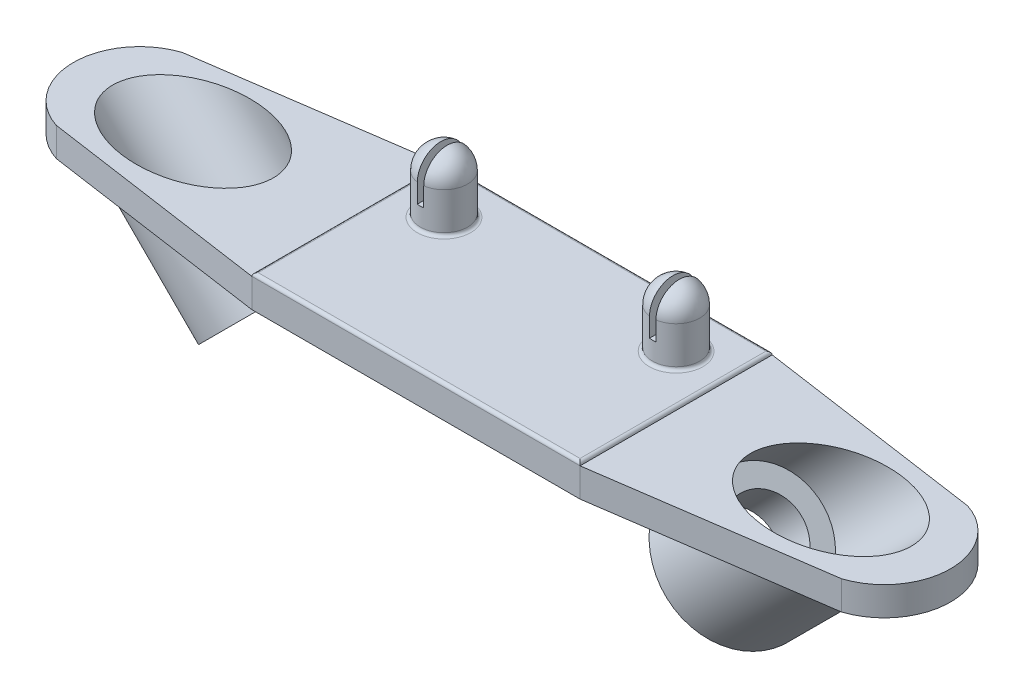
ISO-10303-21;
HEADER;
FILE_DESCRIPTION(('STEP AP214'),'2;1');
FILE_NAME('part.step','',(''),(''),'','','');
FILE_SCHEMA(('AUTOMOTIVE_DESIGN { 1 0 10303 214 1 1 1 1 }'));
ENDSEC;
DATA;
#1=APPLICATION_CONTEXT('core data for automotive mechanical design processes');
#2=APPLICATION_PROTOCOL_DEFINITION('international standard','automotive_design',2000,#1);
#3=PRODUCT_CONTEXT('',#1,'mechanical');
#4=PRODUCT('Part','Part','',(#3));
#5=PRODUCT_RELATED_PRODUCT_CATEGORY('part','',(#4));
#6=PRODUCT_DEFINITION_FORMATION('','',#4);
#7=PRODUCT_DEFINITION_CONTEXT('part definition',#1,'design');
#8=PRODUCT_DEFINITION('design','',#6,#7);
#9=PRODUCT_DEFINITION_SHAPE('','',#8);
#10=(LENGTH_UNIT() NAMED_UNIT(*) SI_UNIT(.MILLI.,.METRE.));
#11=(NAMED_UNIT(*) PLANE_ANGLE_UNIT() SI_UNIT($,.RADIAN.));
#12=(NAMED_UNIT(*) SI_UNIT($,.STERADIAN.) SOLID_ANGLE_UNIT());
#13=UNCERTAINTY_MEASURE_WITH_UNIT(LENGTH_MEASURE(1.E-05),#10,'distance_accuracy_value','');
#14=(GEOMETRIC_REPRESENTATION_CONTEXT(3) GLOBAL_UNCERTAINTY_ASSIGNED_CONTEXT((#13)) GLOBAL_UNIT_ASSIGNED_CONTEXT((#10,
#11,#12)) REPRESENTATION_CONTEXT('',''));
#15=CARTESIAN_POINT('',(0.,0.,0.));
#16=DIRECTION('',(0.,0.,1.));
#17=DIRECTION('',(1.,0.,0.));
#18=AXIS2_PLACEMENT_3D('',#15,#16,#17);
#19=CARTESIAN_POINT('',(7.25,6.,-2.99999999999999));
#20=DIRECTION('',(0.,-1.,0.));
#21=DIRECTION('',(0.,0.,-1.));
#22=AXIS2_PLACEMENT_3D('',#19,#20,#21);
#23=CYLINDRICAL_SURFACE('',#22,1.475);
#24=CARTESIAN_POINT('',(7.25,2.2,-2.99999999999999));
#25=DIRECTION('',(0.,-1.,0.));
#26=DIRECTION('',(0.,0.,-1.));
#27=AXIS2_PLACEMENT_3D('',#24,#25,#26);
#28=CIRCLE('',#27,1.475);
#29=CARTESIAN_POINT('',(7.25,2.2,-4.47499999999999));
#30=VERTEX_POINT('',#29);
#31=EDGE_CURVE('E320',#30,#30,#28,.F.);
#32=ORIENTED_EDGE('',*,*,#31,.T.);
#33=EDGE_LOOP('',(#32));
#34=FACE_BOUND('',#33,.T.);
#35=DIRECTION('',(0.,-1.,0.));
#36=VECTOR('',#35,1.);
#37=CARTESIAN_POINT('',(7.05,6.,-4.46137777456754));
#38=LINE('',#37,#36);
#39=CARTESIAN_POINT('',(7.05,3.33333333333333,-4.46137777456754));
#40=VERTEX_POINT('',#39);
#41=CARTESIAN_POINT('',(7.05,4.525,-4.46137777456754));
#42=VERTEX_POINT('',#41);
#43=EDGE_CURVE('E169',#40,#42,#38,.F.);
#44=ORIENTED_EDGE('',*,*,#43,.F.);
#45=CARTESIAN_POINT('',(7.25,3.33333333333333,-2.99999999999999));
#46=DIRECTION('',(0.,1.,0.));
#47=DIRECTION('',(0.,0.,1.));
#48=AXIS2_PLACEMENT_3D('',#45,#46,#47);
#49=CIRCLE('',#48,1.475);
#50=CARTESIAN_POINT('',(7.45,3.33333333333333,-4.46137777456754));
#51=VERTEX_POINT('',#50);
#52=EDGE_CURVE('E11',#51,#40,#49,.T.);
#53=ORIENTED_EDGE('',*,*,#52,.F.);
#54=DIRECTION('',(0.,-1.,0.));
#55=VECTOR('',#54,1.);
#56=CARTESIAN_POINT('',(7.45,6.,-4.46137777456754));
#57=LINE('',#56,#55);
#58=CARTESIAN_POINT('',(7.45,4.525,-4.46137777456754));
#59=VERTEX_POINT('',#58);
#60=EDGE_CURVE('E160',#59,#51,#57,.T.);
#61=ORIENTED_EDGE('',*,*,#60,.F.);
#62=CARTESIAN_POINT('',(7.25,4.525,-2.99999999999999));
#63=DIRECTION('',(0.,-1.,0.));
#64=DIRECTION('',(0.,0.,-1.));
#65=AXIS2_PLACEMENT_3D('',#62,#63,#64);
#66=CIRCLE('',#65,1.475);
#67=CARTESIAN_POINT('',(7.45,4.525,-1.53862222543244));
#68=VERTEX_POINT('',#67);
#69=EDGE_CURVE('E285',#59,#68,#66,.T.);
#70=ORIENTED_EDGE('',*,*,#69,.T.);
#71=DIRECTION('',(0.,-1.,0.));
#72=VECTOR('',#71,1.);
#73=CARTESIAN_POINT('',(7.45,6.,-1.53862222543244));
#74=LINE('',#73,#72);
#75=CARTESIAN_POINT('',(7.45,3.33333333333333,-1.53862222543244));
#76=VERTEX_POINT('',#75);
#77=EDGE_CURVE('E51',#76,#68,#74,.F.);
#78=ORIENTED_EDGE('',*,*,#77,.F.);
#79=CARTESIAN_POINT('',(7.05,3.33333333333333,-1.53862222543244));
#80=VERTEX_POINT('',#79);
#81=EDGE_CURVE('E40',#80,#76,#49,.T.);
#82=ORIENTED_EDGE('',*,*,#81,.F.);
#83=DIRECTION('',(0.,-1.,0.));
#84=VECTOR('',#83,1.);
#85=CARTESIAN_POINT('',(7.05,6.,-1.53862222543244));
#86=LINE('',#85,#84);
#87=CARTESIAN_POINT('',(7.05,4.525,-1.53862222543244));
#88=VERTEX_POINT('',#87);
#89=EDGE_CURVE('E185',#88,#80,#86,.T.);
#90=ORIENTED_EDGE('',*,*,#89,.F.);
#91=EDGE_CURVE('E182',#88,#42,#66,.T.);
#92=ORIENTED_EDGE('',*,*,#91,.T.);
#93=EDGE_LOOP('',(#44,#53,#61,#70,#78,#82,#90,#92));
#94=FACE_BOUND('',#93,.T.);
#95=ADVANCED_FACE('F36',(#34,#94),#23,.T.);
#96=CARTESIAN_POINT('',(7.25,4.525,-2.99999999999999));
#97=DIRECTION('',(0.,-1.,0.));
#98=DIRECTION('',(0.,0.,-1.));
#99=AXIS2_PLACEMENT_3D('',#96,#97,#98);
#100=SPHERICAL_SURFACE('',#99,1.475);
#101=ORIENTED_EDGE('',*,*,#91,.F.);
#102=CARTESIAN_POINT('',(7.05,4.525,-2.99999999999999));
#103=DIRECTION('',(1.,0.,0.));
#104=DIRECTION('',(0.,0.,-1.));
#105=AXIS2_PLACEMENT_3D('',#102,#103,#104);
#106=CIRCLE('',#105,1.46137777456755);
#107=EDGE_CURVE('E353',#88,#42,#106,.F.);
#108=ORIENTED_EDGE('',*,*,#107,.T.);
#109=EDGE_LOOP('',(#101,#108));
#110=FACE_BOUND('',#109,.T.);
#111=ADVANCED_FACE('F355',(#110),#100,.T.);
#112=ORIENTED_EDGE('',*,*,#69,.F.);
#113=CARTESIAN_POINT('',(7.45,4.525,-2.99999999999999));
#114=DIRECTION('',(-1.,0.,0.));
#115=DIRECTION('',(0.,0.,1.));
#116=AXIS2_PLACEMENT_3D('',#113,#114,#115);
#117=CIRCLE('',#116,1.46137777456755);
#118=EDGE_CURVE('E164',#59,#68,#117,.F.);
#119=ORIENTED_EDGE('',*,*,#118,.T.);
#120=EDGE_LOOP('',(#112,#119));
#121=FACE_BOUND('',#120,.T.);
#122=ADVANCED_FACE('F359',(#121),#100,.T.);
#123=CARTESIAN_POINT('',(-7.25,4.525,-3.));
#124=DIRECTION('',(0.,1.,0.));
#125=DIRECTION('',(0.,0.,1.));
#126=AXIS2_PLACEMENT_3D('',#123,#124,#125);
#127=SPHERICAL_SURFACE('',#126,1.475);
#128=CARTESIAN_POINT('',(-7.05,4.525,-3.));
#129=DIRECTION('',(1.,0.,0.));
#130=DIRECTION('',(0.,0.,-1.));
#131=AXIS2_PLACEMENT_3D('',#128,#129,#130);
#132=CIRCLE('',#131,1.46137777456755);
#133=CARTESIAN_POINT('',(-7.05,4.525,-1.53862222543245));
#134=VERTEX_POINT('',#133);
#135=CARTESIAN_POINT('',(-7.05,4.525,-4.46137777456754));
#136=VERTEX_POINT('',#135);
#137=EDGE_CURVE('E347',#134,#136,#132,.F.);
#138=ORIENTED_EDGE('',*,*,#137,.F.);
#139=CARTESIAN_POINT('',(-7.25,4.525,-3.));
#140=DIRECTION('',(0.,-1.,0.));
#141=DIRECTION('',(0.,0.,-1.));
#142=AXIS2_PLACEMENT_3D('',#139,#140,#141);
#143=CIRCLE('',#142,1.475);
#144=EDGE_CURVE('E288',#136,#134,#143,.T.);
#145=ORIENTED_EDGE('',*,*,#144,.F.);
#146=EDGE_LOOP('',(#138,#145));
#147=FACE_BOUND('',#146,.T.);
#148=ADVANCED_FACE('F361',(#147),#127,.T.);
#149=CARTESIAN_POINT('',(23.25,1.8,0.));
#150=DIRECTION('',(0.,1.,0.));
#151=DIRECTION('',(0.,0.,1.));
#152=AXIS2_PLACEMENT_3D('',#149,#150,#151);
#153=PLANE('',#152);
#154=DIRECTION('',(0.,0.,-1.));
#155=VECTOR('',#154,1.);
#156=CARTESIAN_POINT('',(10.25,1.8,6.));
#157=LINE('',#156,#155);
#158=CARTESIAN_POINT('',(10.25,1.8,-6.));
#159=VERTEX_POINT('',#158);
#160=CARTESIAN_POINT('',(10.25,1.8,6.));
#161=VERTEX_POINT('',#160);
#162=EDGE_CURVE('E314',#159,#161,#157,.F.);
#163=ORIENTED_EDGE('',*,*,#162,.T.);
#164=DIRECTION('',(-0.989730273065848,0.,0.142947495875244));
#165=VECTOR('',#164,1.);
#166=CARTESIAN_POINT('',(10.25,1.8,6.));
#167=LINE('',#166,#165);
#168=CARTESIAN_POINT('',(24.5179821671546,1.8,3.9392644870107));
#169=VERTEX_POINT('',#168);
#170=EDGE_CURVE('E255',#169,#161,#167,.T.);
#171=ORIENTED_EDGE('',*,*,#170,.F.);
#172=CARTESIAN_POINT('',(23.25,1.8,0.));
#173=DIRECTION('',(0.,-1.,0.));
#174=DIRECTION('',(0.,0.,1.));
#175=AXIS2_PLACEMENT_3D('',#172,#173,#174);
#176=CIRCLE('',#175,4.13830683672025);
#177=CARTESIAN_POINT('',(24.5179821671546,1.8,-3.9392644870107));
#178=VERTEX_POINT('',#177);
#179=EDGE_CURVE('E251',#178,#169,#176,.T.);
#180=ORIENTED_EDGE('',*,*,#179,.F.);
#181=DIRECTION('',(0.989730273065848,0.,0.142947495875245));
#182=VECTOR('',#181,1.);
#183=CARTESIAN_POINT('',(10.25,1.8,-6.));
#184=LINE('',#183,#182);
#185=EDGE_CURVE('E248',#159,#178,#184,.T.);
#186=ORIENTED_EDGE('',*,*,#185,.F.);
#187=EDGE_LOOP('',(#163,#171,#180,#186));
#188=FACE_BOUND('',#187,.T.);
#189=CARTESIAN_POINT('',(19.92,1.8,0.));
#190=DIRECTION('',(0.,1.,0.));
#191=DIRECTION('',(1.,0.,0.));
#192=AXIS2_PLACEMENT_3D('',#189,#190,#191);
#193=ELLIPSE('',#192,5.02045814642446,3.55);
#194=CARTESIAN_POINT('',(24.9404581464244,1.8,0.));
#195=VERTEX_POINT('',#194);
#196=EDGE_CURVE('E340',#195,#195,#193,.T.);
#197=ORIENTED_EDGE('',*,*,#196,.F.);
#198=EDGE_LOOP('',(#197));
#199=FACE_BOUND('',#198,.T.);
#200=ADVANCED_FACE('F367',(#188,#199),#153,.T.);
#201=CARTESIAN_POINT('',(-23.25,1.8,0.));
#202=DIRECTION('',(0.,1.,0.));
#203=DIRECTION('',(0.,0.,1.));
#204=AXIS2_PLACEMENT_3D('',#201,#202,#203);
#205=PLANE('',#204);
#206=CARTESIAN_POINT('',(-19.92,1.8,0.));
#207=DIRECTION('',(0.,1.,0.));
#208=DIRECTION('',(-1.,0.,0.));
#209=AXIS2_PLACEMENT_3D('',#206,#207,#208);
#210=ELLIPSE('',#209,5.02045814642446,3.55);
#211=CARTESIAN_POINT('',(-24.9404581464244,1.8,0.));
#212=VERTEX_POINT('',#211);
#213=EDGE_CURVE('E323',#212,#212,#210,.F.);
#214=ORIENTED_EDGE('',*,*,#213,.T.);
#215=EDGE_LOOP('',(#214));
#216=FACE_BOUND('',#215,.T.);
#217=DIRECTION('',(0.,0.,1.));
#218=VECTOR('',#217,1.);
#219=CARTESIAN_POINT('',(-10.25,1.8,6.));
#220=LINE('',#219,#218);
#221=CARTESIAN_POINT('',(-10.25,1.8,6.));
#222=VERTEX_POINT('',#221);
#223=CARTESIAN_POINT('',(-10.25,1.8,-6.));
#224=VERTEX_POINT('',#223);
#225=EDGE_CURVE('E309',#222,#224,#220,.F.);
#226=ORIENTED_EDGE('',*,*,#225,.T.);
#227=DIRECTION('',(-0.989730273065848,0.,0.142947495875245));
#228=VECTOR('',#227,1.);
#229=CARTESIAN_POINT('',(-10.25,1.8,-6.));
#230=LINE('',#229,#228);
#231=CARTESIAN_POINT('',(-24.5179821671546,1.8,-3.9392644870107));
#232=VERTEX_POINT('',#231);
#233=EDGE_CURVE('E234',#224,#232,#230,.T.);
#234=ORIENTED_EDGE('',*,*,#233,.T.);
#235=CARTESIAN_POINT('',(-23.25,1.8,0.));
#236=DIRECTION('',(0.,1.,0.));
#237=DIRECTION('',(0.,0.,1.));
#238=AXIS2_PLACEMENT_3D('',#235,#236,#237);
#239=CIRCLE('',#238,4.13830683672025);
#240=CARTESIAN_POINT('',(-24.5179821671546,1.8,3.9392644870107));
#241=VERTEX_POINT('',#240);
#242=EDGE_CURVE('E231',#232,#241,#239,.T.);
#243=ORIENTED_EDGE('',*,*,#242,.T.);
#244=DIRECTION('',(0.989730273065848,0.,0.142947495875244));
#245=VECTOR('',#244,1.);
#246=CARTESIAN_POINT('',(-10.25,1.8,6.));
#247=LINE('',#246,#245);
#248=EDGE_CURVE('E228',#241,#222,#247,.T.);
#249=ORIENTED_EDGE('',*,*,#248,.T.);
#250=EDGE_LOOP('',(#226,#234,#243,#249));
#251=FACE_BOUND('',#250,.T.);
#252=ADVANCED_FACE('F411',(#216,#251),#205,.T.);
#253=CARTESIAN_POINT('',(-8.25100460412922,-26.3710046041293,0.));
#254=DIRECTION('',(0.707106781186546,0.707106781186549,0.));
#255=DIRECTION('',(-0.707106781186549,0.707106781186546,0.));
#256=AXIS2_PLACEMENT_3D('',#253,#254,#255);
#257=CYLINDRICAL_SURFACE('',#256,2.25);
#258=CARTESIAN_POINT('',(15.8541360081773,-2.26586399182267,0.));
#259=DIRECTION('',(-0.707106781186544,-0.707106781186551,0.));
#260=DIRECTION('',(0.707106781186551,-0.707106781186544,0.));
#261=AXIS2_PLACEMENT_3D('',#258,#259,#260);
#262=CIRCLE('',#261,2.25);
#263=CARTESIAN_POINT('',(17.4451262658471,-3.85685424949239,0.));
#264=VERTEX_POINT('',#263);
#265=EDGE_CURVE('E209',#264,#264,#262,.T.);
#266=ORIENTED_EDGE('',*,*,#265,.F.);
#267=EDGE_LOOP('',(#266));
#268=FACE_BOUND('',#267,.T.);
#269=CARTESIAN_POINT('',(14.0682781438011,-4.05172185619893,0.));
#270=DIRECTION('',(0.707106781186546,0.707106781186549,0.));
#271=DIRECTION('',(-0.707106781186549,0.707106781186546,0.));
#272=AXIS2_PLACEMENT_3D('',#269,#270,#271);
#273=CIRCLE('',#272,2.25);
#274=CARTESIAN_POINT('',(12.4772878861314,-2.4607315985292,0.));
#275=VERTEX_POINT('',#274);
#276=EDGE_CURVE('E218',#275,#275,#273,.F.);
#277=ORIENTED_EDGE('',*,*,#276,.T.);
#278=EDGE_LOOP('',(#277));
#279=FACE_BOUND('',#278,.T.);
#280=ADVANCED_FACE('F394',(#268,#279),#257,.F.);
#281=CARTESIAN_POINT('',(0.,0.,0.));
#282=DIRECTION('',(0.,-1.,0.));
#283=DIRECTION('',(0.,0.,-1.));
#284=AXIS2_PLACEMENT_3D('',#281,#282,#283);
#285=PLANE('',#284);
#286=CARTESIAN_POINT('',(18.12,0.,0.));
#287=DIRECTION('',(0.,-1.,0.));
#288=DIRECTION('',(1.,0.,0.));
#289=AXIS2_PLACEMENT_3D('',#286,#287,#288);
#290=ELLIPSE('',#289,6.36396103067891,4.5);
#291=CARTESIAN_POINT('',(24.4839610306789,0.,0.));
#292=VERTEX_POINT('',#291);
#293=EDGE_CURVE('E224',#292,#292,#290,.F.);
#294=ORIENTED_EDGE('',*,*,#293,.T.);
#295=EDGE_LOOP('',(#294));
#296=FACE_BOUND('',#295,.T.);
#297=DIRECTION('',(-1.,0.,0.));
#298=VECTOR('',#297,1.);
#299=CARTESIAN_POINT('',(-10.25,0.,-6.));
#300=LINE('',#299,#298);
#301=CARTESIAN_POINT('',(10.25,0.,-6.));
#302=VERTEX_POINT('',#301);
#303=CARTESIAN_POINT('',(-10.25,0.,-6.));
#304=VERTEX_POINT('',#303);
#305=EDGE_CURVE('E270',#302,#304,#300,.T.);
#306=ORIENTED_EDGE('',*,*,#305,.F.);
#307=DIRECTION('',(0.989730273065848,0.,0.142947495875245));
#308=VECTOR('',#307,1.);
#309=CARTESIAN_POINT('',(10.25,0.,-6.));
#310=LINE('',#309,#308);
#311=CARTESIAN_POINT('',(24.5179821671546,0.,-3.9392644870107));
#312=VERTEX_POINT('',#311);
#313=EDGE_CURVE('E245',#302,#312,#310,.T.);
#314=ORIENTED_EDGE('',*,*,#313,.T.);
#315=CARTESIAN_POINT('',(23.25,0.,0.));
#316=DIRECTION('',(0.,-1.,0.));
#317=DIRECTION('',(0.,0.,1.));
#318=AXIS2_PLACEMENT_3D('',#315,#316,#317);
#319=CIRCLE('',#318,4.13830683672025);
#320=CARTESIAN_POINT('',(24.5179821671546,0.,3.9392644870107));
#321=VERTEX_POINT('',#320);
#322=EDGE_CURVE('E261',#312,#321,#319,.T.);
#323=ORIENTED_EDGE('',*,*,#322,.T.);
#324=DIRECTION('',(-0.989730273065848,0.,0.142947495875244));
#325=VECTOR('',#324,1.);
#326=CARTESIAN_POINT('',(10.25,0.,6.));
#327=LINE('',#326,#325);
#328=CARTESIAN_POINT('',(10.25,0.,6.));
#329=VERTEX_POINT('',#328);
#330=EDGE_CURVE('E252',#321,#329,#327,.T.);
#331=ORIENTED_EDGE('',*,*,#330,.T.);
#332=DIRECTION('',(1.,0.,0.));
#333=VECTOR('',#332,1.);
#334=CARTESIAN_POINT('',(-10.25,0.,6.));
#335=LINE('',#334,#333);
#336=CARTESIAN_POINT('',(-10.25,0.,6.));
#337=VERTEX_POINT('',#336);
#338=EDGE_CURVE('E272',#337,#329,#335,.T.);
#339=ORIENTED_EDGE('',*,*,#338,.F.);
#340=DIRECTION('',(0.989730273065848,0.,0.142947495875244));
#341=VECTOR('',#340,1.);
#342=CARTESIAN_POINT('',(-10.25,0.,6.));
#343=LINE('',#342,#341);
#344=CARTESIAN_POINT('',(-24.5179821671546,0.,3.9392644870107));
#345=VERTEX_POINT('',#344);
#346=EDGE_CURVE('E227',#345,#337,#343,.T.);
#347=ORIENTED_EDGE('',*,*,#346,.F.);
#348=CARTESIAN_POINT('',(-23.25,0.,0.));
#349=DIRECTION('',(0.,1.,0.));
#350=DIRECTION('',(0.,0.,1.));
#351=AXIS2_PLACEMENT_3D('',#348,#349,#350);
#352=CIRCLE('',#351,4.13830683672025);
#353=CARTESIAN_POINT('',(-24.5179821671546,0.,-3.9392644870107));
#354=VERTEX_POINT('',#353);
#355=EDGE_CURVE('E239',#354,#345,#352,.T.);
#356=ORIENTED_EDGE('',*,*,#355,.F.);
#357=DIRECTION('',(-0.989730273065848,0.,0.142947495875245));
#358=VECTOR('',#357,1.);
#359=CARTESIAN_POINT('',(-10.25,0.,-6.));
#360=LINE('',#359,#358);
#361=EDGE_CURVE('E232',#304,#354,#360,.T.);
#362=ORIENTED_EDGE('',*,*,#361,.F.);
#363=EDGE_LOOP('',(#306,#314,#323,#331,#339,#347,#356,#362));
#364=FACE_BOUND('',#363,.T.);
#365=CARTESIAN_POINT('',(-18.12,0.,0.));
#366=DIRECTION('',(0.,-1.,0.));
#367=DIRECTION('',(-1.,0.,0.));
#368=AXIS2_PLACEMENT_3D('',#365,#366,#367);
#369=ELLIPSE('',#368,6.36396103067891,4.5);
#370=CARTESIAN_POINT('',(-24.4839610306789,0.,0.));
#371=VERTEX_POINT('',#370);
#372=EDGE_CURVE('E217',#371,#371,#369,.F.);
#373=ORIENTED_EDGE('',*,*,#372,.T.);
#374=EDGE_LOOP('',(#373));
#375=FACE_BOUND('',#374,.T.);
#376=ADVANCED_FACE('F390',(#296,#364,#375),#285,.T.);
#377=CARTESIAN_POINT('',(-10.25,2.,-6.));
#378=DIRECTION('',(0.,0.,1.));
#379=DIRECTION('',(1.,0.,0.));
#380=AXIS2_PLACEMENT_3D('',#377,#378,#379);
#381=PLANE('',#380);
#382=DIRECTION('',(0.,-1.,0.));
#383=VECTOR('',#382,1.);
#384=CARTESIAN_POINT('',(-10.25,2.,-6.));
#385=LINE('',#384,#383);
#386=EDGE_CURVE('E280',#224,#304,#385,.T.);
#387=ORIENTED_EDGE('',*,*,#386,.F.);
#388=DIRECTION('',(-1.,0.,0.));
#389=VECTOR('',#388,1.);
#390=CARTESIAN_POINT('',(-10.25,1.8,-6.));
#391=LINE('',#390,#389);
#392=EDGE_CURVE('E312',#224,#159,#391,.F.);
#393=ORIENTED_EDGE('',*,*,#392,.T.);
#394=DIRECTION('',(0.,-1.,0.));
#395=VECTOR('',#394,1.);
#396=CARTESIAN_POINT('',(10.25,2.,-6.));
#397=LINE('',#396,#395);
#398=EDGE_CURVE('E283',#159,#302,#397,.T.);
#399=ORIENTED_EDGE('',*,*,#398,.T.);
#400=ORIENTED_EDGE('',*,*,#305,.T.);
#401=EDGE_LOOP('',(#387,#393,#399,#400));
#402=FACE_BOUND('',#401,.T.);
#403=ADVANCED_FACE('F393',(#402),#381,.F.);
#404=CARTESIAN_POINT('',(-10.25,2.,6.));
#405=DIRECTION('',(0.,0.,-1.));
#406=DIRECTION('',(-1.,0.,0.));
#407=AXIS2_PLACEMENT_3D('',#404,#405,#406);
#408=PLANE('',#407);
#409=DIRECTION('',(0.,-1.,0.));
#410=VECTOR('',#409,1.);
#411=CARTESIAN_POINT('',(10.25,2.,6.));
#412=LINE('',#411,#410);
#413=EDGE_CURVE('E275',#161,#329,#412,.T.);
#414=ORIENTED_EDGE('',*,*,#413,.F.);
#415=DIRECTION('',(1.,0.,0.));
#416=VECTOR('',#415,1.);
#417=CARTESIAN_POINT('',(-10.25,1.8,6.));
#418=LINE('',#417,#416);
#419=EDGE_CURVE('E306',#161,#222,#418,.F.);
#420=ORIENTED_EDGE('',*,*,#419,.T.);
#421=DIRECTION('',(0.,-1.,0.));
#422=VECTOR('',#421,1.);
#423=CARTESIAN_POINT('',(-10.25,2.,6.));
#424=LINE('',#423,#422);
#425=EDGE_CURVE('E278',#222,#337,#424,.T.);
#426=ORIENTED_EDGE('',*,*,#425,.T.);
#427=ORIENTED_EDGE('',*,*,#338,.T.);
#428=EDGE_LOOP('',(#414,#420,#426,#427));
#429=FACE_BOUND('',#428,.T.);
#430=ADVANCED_FACE('F388',(#429),#408,.F.);
#431=CARTESIAN_POINT('',(0.,2.,0.));
#432=DIRECTION('',(0.,-1.,0.));
#433=DIRECTION('',(0.,0.,-1.));
#434=AXIS2_PLACEMENT_3D('',#431,#432,#433);
#435=PLANE('',#434);
#436=DIRECTION('',(0.,0.,1.));
#437=VECTOR('',#436,1.);
#438=CARTESIAN_POINT('',(-10.05,2.,0.));
#439=LINE('',#438,#437);
#440=CARTESIAN_POINT('',(-10.05,2.,-5.80000000000001));
#441=VERTEX_POINT('',#440);
#442=CARTESIAN_POINT('',(-10.05,2.,5.8));
#443=VERTEX_POINT('',#442);
#444=EDGE_CURVE('E301',#441,#443,#439,.T.);
#445=ORIENTED_EDGE('',*,*,#444,.T.);
#446=DIRECTION('',(1.,0.,0.));
#447=VECTOR('',#446,1.);
#448=CARTESIAN_POINT('',(0.,2.,5.8));
#449=LINE('',#448,#447);
#450=CARTESIAN_POINT('',(10.05,2.,5.8));
#451=VERTEX_POINT('',#450);
#452=EDGE_CURVE('E303',#443,#451,#449,.T.);
#453=ORIENTED_EDGE('',*,*,#452,.T.);
#454=DIRECTION('',(0.,0.,-1.));
#455=VECTOR('',#454,1.);
#456=CARTESIAN_POINT('',(10.05,2.,0.));
#457=LINE('',#456,#455);
#458=CARTESIAN_POINT('',(10.05,2.,-5.8));
#459=VERTEX_POINT('',#458);
#460=EDGE_CURVE('E297',#451,#459,#457,.T.);
#461=ORIENTED_EDGE('',*,*,#460,.T.);
#462=DIRECTION('',(-1.,0.,0.));
#463=VECTOR('',#462,1.);
#464=CARTESIAN_POINT('',(0.,2.,-5.8));
#465=LINE('',#464,#463);
#466=EDGE_CURVE('E299',#459,#441,#465,.T.);
#467=ORIENTED_EDGE('',*,*,#466,.T.);
#468=EDGE_LOOP('',(#445,#453,#461,#467));
#469=FACE_BOUND('',#468,.T.);
#470=CARTESIAN_POINT('',(-7.25,2.,-3.));
#471=DIRECTION('',(0.,-1.,0.));
#472=DIRECTION('',(0.,0.,-1.));
#473=AXIS2_PLACEMENT_3D('',#470,#471,#472);
#474=CIRCLE('',#473,1.675);
#475=CARTESIAN_POINT('',(-7.25,2.,-4.675));
#476=VERTEX_POINT('',#475);
#477=EDGE_CURVE('E294',#476,#476,#474,.T.);
#478=ORIENTED_EDGE('',*,*,#477,.T.);
#479=EDGE_LOOP('',(#478));
#480=FACE_BOUND('',#479,.T.);
#481=CARTESIAN_POINT('',(7.25,2.,-2.99999999999999));
#482=DIRECTION('',(0.,-1.,0.));
#483=DIRECTION('',(0.,0.,-1.));
#484=AXIS2_PLACEMENT_3D('',#481,#482,#483);
#485=CIRCLE('',#484,1.675);
#486=CARTESIAN_POINT('',(7.25,2.,-4.67499999999999));
#487=VERTEX_POINT('',#486);
#488=EDGE_CURVE('E291',#487,#487,#485,.T.);
#489=ORIENTED_EDGE('',*,*,#488,.T.);
#490=EDGE_LOOP('',(#489));
#491=FACE_BOUND('',#490,.T.);
#492=ADVANCED_FACE('F384',(#469,#480,#491),#435,.F.);
#493=CARTESIAN_POINT('',(-7.25,6.,-3.));
#494=DIRECTION('',(0.,-1.,0.));
#495=DIRECTION('',(0.,0.,-1.));
#496=AXIS2_PLACEMENT_3D('',#493,#494,#495);
#497=CYLINDRICAL_SURFACE('',#496,1.475);
#498=CARTESIAN_POINT('',(-7.25,2.2,-3.));
#499=DIRECTION('',(0.,-1.,0.));
#500=DIRECTION('',(0.,0.,-1.));
#501=AXIS2_PLACEMENT_3D('',#498,#499,#500);
#502=CIRCLE('',#501,1.475);
#503=CARTESIAN_POINT('',(-7.25,2.2,-4.475));
#504=VERTEX_POINT('',#503);
#505=EDGE_CURVE('E317',#504,#504,#502,.F.);
#506=ORIENTED_EDGE('',*,*,#505,.T.);
#507=EDGE_LOOP('',(#506));
#508=FACE_BOUND('',#507,.T.);
#509=CARTESIAN_POINT('',(-7.25,3.33333333333333,-3.));
#510=DIRECTION('',(0.,-1.,0.));
#511=DIRECTION('',(0.,0.,-1.));
#512=AXIS2_PLACEMENT_3D('',#509,#510,#511);
#513=CIRCLE('',#512,1.475);
#514=CARTESIAN_POINT('',(-7.45,3.33333333333333,-4.46137777456754));
#515=VERTEX_POINT('',#514);
#516=CARTESIAN_POINT('',(-7.05,3.33333333333333,-4.46137777456754));
#517=VERTEX_POINT('',#516);
#518=EDGE_CURVE('E352',#515,#517,#513,.T.);
#519=ORIENTED_EDGE('',*,*,#518,.T.);
#520=DIRECTION('',(0.,-1.,0.));
#521=VECTOR('',#520,1.);
#522=CARTESIAN_POINT('',(-7.05,6.,-4.46137777456754));
#523=LINE('',#522,#521);
#524=EDGE_CURVE('E200',#517,#136,#523,.F.);
#525=ORIENTED_EDGE('',*,*,#524,.T.);
#526=ORIENTED_EDGE('',*,*,#144,.T.);
#527=DIRECTION('',(0.,-1.,0.));
#528=VECTOR('',#527,1.);
#529=CARTESIAN_POINT('',(-7.05,6.,-1.53862222543245));
#530=LINE('',#529,#528);
#531=CARTESIAN_POINT('',(-7.05,3.33333333333333,-1.53862222543245));
#532=VERTEX_POINT('',#531);
#533=EDGE_CURVE('E203',#134,#532,#530,.T.);
#534=ORIENTED_EDGE('',*,*,#533,.T.);
#535=CARTESIAN_POINT('',(-7.45,3.33333333333333,-1.53862222543245));
#536=VERTEX_POINT('',#535);
#537=EDGE_CURVE('E349',#532,#536,#513,.T.);
#538=ORIENTED_EDGE('',*,*,#537,.T.);
#539=DIRECTION('',(0.,-1.,0.));
#540=VECTOR('',#539,1.);
#541=CARTESIAN_POINT('',(-7.45,6.,-1.53862222543245));
#542=LINE('',#541,#540);
#543=CARTESIAN_POINT('',(-7.45,4.525,-1.53862222543245));
#544=VERTEX_POINT('',#543);
#545=EDGE_CURVE('E194',#536,#544,#542,.F.);
#546=ORIENTED_EDGE('',*,*,#545,.T.);
#547=CARTESIAN_POINT('',(-7.45,4.525,-4.46137777456754));
#548=VERTEX_POINT('',#547);
#549=EDGE_CURVE('E287',#544,#548,#143,.T.);
#550=ORIENTED_EDGE('',*,*,#549,.T.);
#551=DIRECTION('',(0.,-1.,0.));
#552=VECTOR('',#551,1.);
#553=CARTESIAN_POINT('',(-7.45,6.,-4.46137777456754));
#554=LINE('',#553,#552);
#555=EDGE_CURVE('E59',#548,#515,#554,.T.);
#556=ORIENTED_EDGE('',*,*,#555,.T.);
#557=EDGE_LOOP('',(#519,#525,#526,#534,#538,#546,#550,#556));
#558=FACE_BOUND('',#557,.T.);
#559=ADVANCED_FACE('F381',(#508,#558),#497,.T.);
#560=CARTESIAN_POINT('',(-7.45,4.525,-3.));
#561=DIRECTION('',(-1.,0.,0.));
#562=DIRECTION('',(0.,0.,1.));
#563=AXIS2_PLACEMENT_3D('',#560,#561,#562);
#564=CIRCLE('',#563,1.46137777456755);
#565=EDGE_CURVE('E343',#548,#544,#564,.F.);
#566=ORIENTED_EDGE('',*,*,#565,.F.);
#567=ORIENTED_EDGE('',*,*,#549,.F.);
#568=EDGE_LOOP('',(#566,#567));
#569=FACE_BOUND('',#568,.T.);
#570=ADVANCED_FACE('F370',(#569),#127,.T.);
#571=CARTESIAN_POINT('',(0.,1.8,-5.8));
#572=DIRECTION('',(-1.,0.,0.));
#573=DIRECTION('',(0.,0.,1.));
#574=AXIS2_PLACEMENT_3D('',#571,#572,#573);
#575=CYLINDRICAL_SURFACE('',#574,0.2);
#576=CARTESIAN_POINT('',(10.05,1.8,-5.8));
#577=DIRECTION('',(-0.707106781186547,0.,-0.707106781186548));
#578=DIRECTION('',(0.707106781186548,0.,-0.707106781186547));
#579=AXIS2_PLACEMENT_3D('',#576,#577,#578);
#580=ELLIPSE('',#579,0.282842712474619,0.2);
#581=EDGE_CURVE('E327',#159,#459,#580,.F.);
#582=ORIENTED_EDGE('',*,*,#581,.F.);
#583=ORIENTED_EDGE('',*,*,#392,.F.);
#584=CARTESIAN_POINT('',(-10.05,1.8,-5.80000000000001));
#585=DIRECTION('',(-0.707106781186548,0.,0.707106781186547));
#586=DIRECTION('',(-0.707106781186547,0.,-0.707106781186548));
#587=AXIS2_PLACEMENT_3D('',#584,#585,#586);
#588=ELLIPSE('',#587,0.282842712474619,0.2);
#589=EDGE_CURVE('E273',#441,#224,#588,.T.);
#590=ORIENTED_EDGE('',*,*,#589,.F.);
#591=ORIENTED_EDGE('',*,*,#466,.F.);
#592=EDGE_LOOP('',(#582,#583,#590,#591));
#593=FACE_BOUND('',#592,.T.);
#594=ADVANCED_FACE('F626',(#593),#575,.T.);
#595=CARTESIAN_POINT('',(-10.05,1.8,0.));
#596=DIRECTION('',(0.,0.,1.));
#597=DIRECTION('',(1.,0.,0.));
#598=AXIS2_PLACEMENT_3D('',#595,#596,#597);
#599=CYLINDRICAL_SURFACE('',#598,0.2);
#600=ORIENTED_EDGE('',*,*,#589,.T.);
#601=ORIENTED_EDGE('',*,*,#225,.F.);
#602=CARTESIAN_POINT('',(-10.05,1.8,5.8));
#603=DIRECTION('',(0.707106781186547,0.,0.707106781186548));
#604=DIRECTION('',(-0.707106781186548,0.,0.707106781186547));
#605=AXIS2_PLACEMENT_3D('',#602,#603,#604);
#606=ELLIPSE('',#605,0.282842712474619,0.2);
#607=EDGE_CURVE('E325',#443,#222,#606,.T.);
#608=ORIENTED_EDGE('',*,*,#607,.F.);
#609=ORIENTED_EDGE('',*,*,#444,.F.);
#610=EDGE_LOOP('',(#600,#601,#608,#609));
#611=FACE_BOUND('',#610,.T.);
#612=ADVANCED_FACE('F622',(#611),#599,.T.);
#613=CARTESIAN_POINT('',(10.05,1.8,0.));
#614=DIRECTION('',(0.,0.,-1.));
#615=DIRECTION('',(-1.,0.,0.));
#616=AXIS2_PLACEMENT_3D('',#613,#614,#615);
#617=CYLINDRICAL_SURFACE('',#616,0.2);
#618=ORIENTED_EDGE('',*,*,#581,.T.);
#619=ORIENTED_EDGE('',*,*,#460,.F.);
#620=CARTESIAN_POINT('',(10.05,1.8,5.8));
#621=DIRECTION('',(0.707106781186547,0.,-0.707106781186547));
#622=DIRECTION('',(-0.707106781186547,0.,-0.707106781186547));
#623=AXIS2_PLACEMENT_3D('',#620,#621,#622);
#624=ELLIPSE('',#623,0.282842712474619,0.2);
#625=EDGE_CURVE('E268',#161,#451,#624,.F.);
#626=ORIENTED_EDGE('',*,*,#625,.F.);
#627=ORIENTED_EDGE('',*,*,#162,.F.);
#628=EDGE_LOOP('',(#618,#619,#626,#627));
#629=FACE_BOUND('',#628,.T.);
#630=ADVANCED_FACE('F443',(#629),#617,.T.);
#631=CARTESIAN_POINT('',(0.,1.8,5.8));
#632=DIRECTION('',(1.,0.,0.));
#633=DIRECTION('',(0.,0.,-1.));
#634=AXIS2_PLACEMENT_3D('',#631,#632,#633);
#635=CYLINDRICAL_SURFACE('',#634,0.2);
#636=ORIENTED_EDGE('',*,*,#607,.T.);
#637=ORIENTED_EDGE('',*,*,#419,.F.);
#638=ORIENTED_EDGE('',*,*,#625,.T.);
#639=ORIENTED_EDGE('',*,*,#452,.F.);
#640=EDGE_LOOP('',(#636,#637,#638,#639));
#641=FACE_BOUND('',#640,.T.);
#642=ADVANCED_FACE('F635',(#641),#635,.T.);
#643=CARTESIAN_POINT('',(-7.25,2.2,-3.));
#644=DIRECTION('',(0.,-1.,0.));
#645=DIRECTION('',(0.,0.,-1.));
#646=AXIS2_PLACEMENT_3D('',#643,#644,#645);
#647=TOROIDAL_SURFACE('',#646,1.675,0.2);
#648=ORIENTED_EDGE('',*,*,#477,.F.);
#649=EDGE_LOOP('',(#648));
#650=FACE_BOUND('',#649,.T.);
#651=ORIENTED_EDGE('',*,*,#505,.F.);
#652=EDGE_LOOP('',(#651));
#653=FACE_BOUND('',#652,.T.);
#654=ADVANCED_FACE('F639',(#650,#653),#647,.F.);
#655=CARTESIAN_POINT('',(7.25,2.2,-2.99999999999999));
#656=DIRECTION('',(0.,-1.,0.));
#657=DIRECTION('',(0.,0.,-1.));
#658=AXIS2_PLACEMENT_3D('',#655,#656,#657);
#659=TOROIDAL_SURFACE('',#658,1.675,0.2);
#660=ORIENTED_EDGE('',*,*,#488,.F.);
#661=EDGE_LOOP('',(#660));
#662=FACE_BOUND('',#661,.T.);
#663=ORIENTED_EDGE('',*,*,#31,.F.);
#664=EDGE_LOOP('',(#663));
#665=FACE_BOUND('',#664,.T.);
#666=ADVANCED_FACE('F38',(#662,#665),#659,.F.);
#667=CARTESIAN_POINT('',(10.25,1.8,6.));
#668=DIRECTION('',(0.142947495875244,0.,0.989730273065848));
#669=DIRECTION('',(0.989730273065848,0.,-0.142947495875244));
#670=AXIS2_PLACEMENT_3D('',#667,#668,#669);
#671=PLANE('',#670);
#672=ORIENTED_EDGE('',*,*,#330,.F.);
#673=DIRECTION('',(0.,-1.,0.));
#674=VECTOR('',#673,1.);
#675=CARTESIAN_POINT('',(24.5179821671546,1.8,3.9392644870107));
#676=LINE('',#675,#674);
#677=EDGE_CURVE('E266',#169,#321,#676,.T.);
#678=ORIENTED_EDGE('',*,*,#677,.F.);
#679=ORIENTED_EDGE('',*,*,#170,.T.);
#680=ORIENTED_EDGE('',*,*,#413,.T.);
#681=EDGE_LOOP('',(#672,#678,#679,#680));
#682=FACE_BOUND('',#681,.T.);
#683=ADVANCED_FACE('F434',(#682),#671,.T.);
#684=CARTESIAN_POINT('',(23.25,1.8,0.));
#685=DIRECTION('',(0.,-1.,0.));
#686=DIRECTION('',(0.,0.,-1.));
#687=AXIS2_PLACEMENT_3D('',#684,#685,#686);
#688=CYLINDRICAL_SURFACE('',#687,4.13830683672025);
#689=ORIENTED_EDGE('',*,*,#322,.F.);
#690=DIRECTION('',(0.,-1.,0.));
#691=VECTOR('',#690,1.);
#692=CARTESIAN_POINT('',(24.5179821671546,1.8,-3.9392644870107));
#693=LINE('',#692,#691);
#694=EDGE_CURVE('E258',#178,#312,#693,.T.);
#695=ORIENTED_EDGE('',*,*,#694,.F.);
#696=ORIENTED_EDGE('',*,*,#179,.T.);
#697=ORIENTED_EDGE('',*,*,#677,.T.);
#698=EDGE_LOOP('',(#689,#695,#696,#697));
#699=FACE_BOUND('',#698,.T.);
#700=ADVANCED_FACE('F448',(#699),#688,.T.);
#701=CARTESIAN_POINT('',(10.25,1.8,-6.));
#702=DIRECTION('',(0.142947495875245,0.,-0.989730273065848));
#703=DIRECTION('',(-0.989730273065848,0.,-0.142947495875245));
#704=AXIS2_PLACEMENT_3D('',#701,#702,#703);
#705=PLANE('',#704);
#706=ORIENTED_EDGE('',*,*,#313,.F.);
#707=ORIENTED_EDGE('',*,*,#398,.F.);
#708=ORIENTED_EDGE('',*,*,#185,.T.);
#709=ORIENTED_EDGE('',*,*,#694,.T.);
#710=EDGE_LOOP('',(#706,#707,#708,#709));
#711=FACE_BOUND('',#710,.T.);
#712=ADVANCED_FACE('F379',(#711),#705,.T.);
#713=CARTESIAN_POINT('',(-10.25,1.8,-6.));
#714=DIRECTION('',(0.142947495875245,0.,0.989730273065848));
#715=DIRECTION('',(0.989730273065848,0.,-0.142947495875245));
#716=AXIS2_PLACEMENT_3D('',#713,#714,#715);
#717=PLANE('',#716);
#718=ORIENTED_EDGE('',*,*,#361,.T.);
#719=DIRECTION('',(0.,-1.,0.));
#720=VECTOR('',#719,1.);
#721=CARTESIAN_POINT('',(-24.5179821671546,1.8,-3.9392644870107));
#722=LINE('',#721,#720);
#723=EDGE_CURVE('E242',#232,#354,#722,.T.);
#724=ORIENTED_EDGE('',*,*,#723,.F.);
#725=ORIENTED_EDGE('',*,*,#233,.F.);
#726=ORIENTED_EDGE('',*,*,#386,.T.);
#727=EDGE_LOOP('',(#718,#724,#725,#726));
#728=FACE_BOUND('',#727,.T.);
#729=ADVANCED_FACE('F417',(#728),#717,.F.);
#730=CARTESIAN_POINT('',(-23.25,1.8,0.));
#731=DIRECTION('',(0.,-1.,0.));
#732=DIRECTION('',(0.,0.,-1.));
#733=AXIS2_PLACEMENT_3D('',#730,#731,#732);
#734=CYLINDRICAL_SURFACE('',#733,4.13830683672025);
#735=ORIENTED_EDGE('',*,*,#355,.T.);
#736=DIRECTION('',(0.,-1.,0.));
#737=VECTOR('',#736,1.);
#738=CARTESIAN_POINT('',(-24.5179821671546,1.8,3.9392644870107));
#739=LINE('',#738,#737);
#740=EDGE_CURVE('E236',#241,#345,#739,.T.);
#741=ORIENTED_EDGE('',*,*,#740,.F.);
#742=ORIENTED_EDGE('',*,*,#242,.F.);
#743=ORIENTED_EDGE('',*,*,#723,.T.);
#744=EDGE_LOOP('',(#735,#741,#742,#743));
#745=FACE_BOUND('',#744,.T.);
#746=ADVANCED_FACE('F422',(#745),#734,.T.);
#747=CARTESIAN_POINT('',(-10.25,1.8,6.));
#748=DIRECTION('',(0.142947495875244,0.,-0.989730273065848));
#749=DIRECTION('',(-0.989730273065848,0.,-0.142947495875244));
#750=AXIS2_PLACEMENT_3D('',#747,#748,#749);
#751=PLANE('',#750);
#752=ORIENTED_EDGE('',*,*,#346,.T.);
#753=ORIENTED_EDGE('',*,*,#425,.F.);
#754=ORIENTED_EDGE('',*,*,#248,.F.);
#755=ORIENTED_EDGE('',*,*,#740,.T.);
#756=EDGE_LOOP('',(#752,#753,#754,#755));
#757=FACE_BOUND('',#756,.T.);
#758=ADVANCED_FACE('F425',(#757),#751,.F.);
#759=CARTESIAN_POINT('',(18.12,0.,0.));
#760=DIRECTION('',(0.707106781186546,0.707106781186549,0.));
#761=DIRECTION('',(-0.707106781186549,0.707106781186546,0.));
#762=AXIS2_PLACEMENT_3D('',#759,#760,#761);
#763=CYLINDRICAL_SURFACE('',#762,4.5);
#764=ORIENTED_EDGE('',*,*,#293,.F.);
#765=EDGE_LOOP('',(#764));
#766=FACE_BOUND('',#765,.T.);
#767=CARTESIAN_POINT('',(14.0682781438011,-4.05172185619893,0.));
#768=DIRECTION('',(0.707106781186546,0.707106781186549,0.));
#769=DIRECTION('',(-0.707106781186549,0.707106781186546,0.));
#770=AXIS2_PLACEMENT_3D('',#767,#768,#769);
#771=CIRCLE('',#770,4.5);
#772=CARTESIAN_POINT('',(10.8862976284616,-0.869741340859472,0.));
#773=VERTEX_POINT('',#772);
#774=EDGE_CURVE('E221',#773,#773,#771,.T.);
#775=ORIENTED_EDGE('',*,*,#774,.T.);
#776=EDGE_LOOP('',(#775));
#777=FACE_BOUND('',#776,.T.);
#778=ADVANCED_FACE('F460',(#766,#777),#763,.T.);
#779=CARTESIAN_POINT('',(14.0682781438011,-4.05172185619893,0.));
#780=DIRECTION('',(0.707106781186546,0.707106781186549,0.));
#781=DIRECTION('',(-0.707106781186549,0.707106781186546,0.));
#782=AXIS2_PLACEMENT_3D('',#779,#780,#781);
#783=PLANE('',#782);
#784=ORIENTED_EDGE('',*,*,#276,.F.);
#785=EDGE_LOOP('',(#784));
#786=FACE_BOUND('',#785,.T.);
#787=ORIENTED_EDGE('',*,*,#774,.F.);
#788=EDGE_LOOP('',(#787));
#789=FACE_BOUND('',#788,.T.);
#790=ADVANCED_FACE('F468',(#786,#789),#783,.F.);
#791=CARTESIAN_POINT('',(-18.12,0.,0.));
#792=DIRECTION('',(-0.707106781186546,0.707106781186549,0.));
#793=DIRECTION('',(0.707106781186549,0.707106781186546,0.));
#794=AXIS2_PLACEMENT_3D('',#791,#792,#793);
#795=CYLINDRICAL_SURFACE('',#794,4.5);
#796=ORIENTED_EDGE('',*,*,#372,.F.);
#797=EDGE_LOOP('',(#796));
#798=FACE_BOUND('',#797,.T.);
#799=CARTESIAN_POINT('',(-14.0682781438011,-4.05172185619893,0.));
#800=DIRECTION('',(0.707106781186546,-0.707106781186549,0.));
#801=DIRECTION('',(0.707106781186549,0.707106781186546,0.));
#802=AXIS2_PLACEMENT_3D('',#799,#800,#801);
#803=CIRCLE('',#802,4.5);
#804=CARTESIAN_POINT('',(-10.8862976284616,-0.869741340859472,0.));
#805=VERTEX_POINT('',#804);
#806=EDGE_CURVE('E214',#805,#805,#803,.T.);
#807=ORIENTED_EDGE('',*,*,#806,.F.);
#808=EDGE_LOOP('',(#807));
#809=FACE_BOUND('',#808,.T.);
#810=ADVANCED_FACE('F471',(#798,#809),#795,.T.);
#811=CARTESIAN_POINT('',(-14.0682781438011,-4.05172185619893,0.));
#812=DIRECTION('',(-0.707106781186546,0.707106781186549,0.));
#813=DIRECTION('',(0.707106781186549,0.707106781186546,0.));
#814=AXIS2_PLACEMENT_3D('',#811,#812,#813);
#815=PLANE('',#814);
#816=CARTESIAN_POINT('',(-14.0682781438011,-4.05172185619893,0.));
#817=DIRECTION('',(-0.707106781186546,0.707106781186549,0.));
#818=DIRECTION('',(-0.707106781186549,-0.707106781186546,0.));
#819=AXIS2_PLACEMENT_3D('',#816,#817,#818);
#820=CIRCLE('',#819,2.25);
#821=CARTESIAN_POINT('',(-15.6592684014708,-5.64271211386866,0.));
#822=VERTEX_POINT('',#821);
#823=EDGE_CURVE('E333',#822,#822,#820,.T.);
#824=ORIENTED_EDGE('',*,*,#823,.T.);
#825=EDGE_LOOP('',(#824));
#826=FACE_BOUND('',#825,.T.);
#827=ORIENTED_EDGE('',*,*,#806,.T.);
#828=EDGE_LOOP('',(#827));
#829=FACE_BOUND('',#828,.T.);
#830=ADVANCED_FACE('F476',(#826,#829),#815,.F.);
#831=CARTESIAN_POINT('',(8.25100460412922,-26.3710046041293,0.));
#832=DIRECTION('',(-0.707106781186546,0.707106781186549,0.));
#833=DIRECTION('',(-0.707106781186549,-0.707106781186546,0.));
#834=AXIS2_PLACEMENT_3D('',#831,#832,#833);
#835=CYLINDRICAL_SURFACE('',#834,2.25);
#836=CARTESIAN_POINT('',(-15.8541360081773,-2.26586399182267,0.));
#837=DIRECTION('',(0.707106781186544,-0.707106781186551,0.));
#838=DIRECTION('',(0.707106781186551,0.707106781186544,0.));
#839=AXIS2_PLACEMENT_3D('',#836,#837,#838);
#840=CIRCLE('',#839,2.25);
#841=CARTESIAN_POINT('',(-14.2631457505076,-0.674873734152945,0.));
#842=VERTEX_POINT('',#841);
#843=EDGE_CURVE('E213',#842,#842,#840,.F.);
#844=ORIENTED_EDGE('',*,*,#843,.T.);
#845=EDGE_LOOP('',(#844));
#846=FACE_BOUND('',#845,.T.);
#847=ORIENTED_EDGE('',*,*,#823,.F.);
#848=EDGE_LOOP('',(#847));
#849=FACE_BOUND('',#848,.T.);
#850=ADVANCED_FACE('F479',(#846,#849),#835,.F.);
#851=CARTESIAN_POINT('',(-15.8541360081773,-2.26586399182266,0.));
#852=DIRECTION('',(0.707106781186544,-0.707106781186551,0.));
#853=DIRECTION('',(0.707106781186551,0.707106781186544,0.));
#854=AXIS2_PLACEMENT_3D('',#851,#852,#853);
#855=PLANE('',#854);
#856=CARTESIAN_POINT('',(-15.8541360081773,-2.26586399182266,0.));
#857=DIRECTION('',(0.707106781186544,-0.707106781186551,0.));
#858=DIRECTION('',(0.707106781186551,0.707106781186544,0.));
#859=AXIS2_PLACEMENT_3D('',#856,#857,#858);
#860=CIRCLE('',#859,3.55);
#861=CARTESIAN_POINT('',(-13.3439069349651,0.244365081389568,0.));
#862=VERTEX_POINT('',#861);
#863=EDGE_CURVE('E210',#862,#862,#860,.T.);
#864=ORIENTED_EDGE('',*,*,#863,.F.);
#865=EDGE_LOOP('',(#864));
#866=FACE_BOUND('',#865,.T.);
#867=ORIENTED_EDGE('',*,*,#843,.F.);
#868=EDGE_LOOP('',(#867));
#869=FACE_BOUND('',#868,.T.);
#870=ADVANCED_FACE('F489',(#866,#869),#855,.F.);
#871=CARTESIAN_POINT('',(-15.8541360081773,-2.26586399182266,0.));
#872=DIRECTION('',(-0.707106781186544,0.707106781186551,0.));
#873=DIRECTION('',(-0.707106781186551,-0.707106781186544,0.));
#874=AXIS2_PLACEMENT_3D('',#871,#872,#873);
#875=CYLINDRICAL_SURFACE('',#874,3.55);
#876=ORIENTED_EDGE('',*,*,#863,.T.);
#877=EDGE_LOOP('',(#876));
#878=FACE_BOUND('',#877,.T.);
#879=ORIENTED_EDGE('',*,*,#213,.F.);
#880=EDGE_LOOP('',(#879));
#881=FACE_BOUND('',#880,.T.);
#882=ADVANCED_FACE('F491',(#878,#881),#875,.F.);
#883=CARTESIAN_POINT('',(15.8541360081773,-2.26586399182266,0.));
#884=DIRECTION('',(0.707106781186544,0.707106781186551,0.));
#885=DIRECTION('',(-0.707106781186551,0.707106781186544,0.));
#886=AXIS2_PLACEMENT_3D('',#883,#884,#885);
#887=CYLINDRICAL_SURFACE('',#886,3.55);
#888=ORIENTED_EDGE('',*,*,#196,.T.);
#889=EDGE_LOOP('',(#888));
#890=FACE_BOUND('',#889,.T.);
#891=CARTESIAN_POINT('',(15.8541360081773,-2.26586399182266,0.));
#892=DIRECTION('',(0.707106781186544,0.707106781186551,0.));
#893=DIRECTION('',(-0.707106781186551,0.707106781186544,0.));
#894=AXIS2_PLACEMENT_3D('',#891,#892,#893);
#895=CIRCLE('',#894,3.55);
#896=CARTESIAN_POINT('',(13.3439069349651,0.244365081389568,0.));
#897=VERTEX_POINT('',#896);
#898=EDGE_CURVE('E206',#897,#897,#895,.T.);
#899=ORIENTED_EDGE('',*,*,#898,.F.);
#900=EDGE_LOOP('',(#899));
#901=FACE_BOUND('',#900,.T.);
#902=ADVANCED_FACE('F494',(#890,#901),#887,.F.);
#903=CARTESIAN_POINT('',(15.8541360081773,-2.26586399182266,0.));
#904=DIRECTION('',(-0.707106781186544,-0.707106781186551,0.));
#905=DIRECTION('',(-0.707106781186551,0.707106781186544,0.));
#906=AXIS2_PLACEMENT_3D('',#903,#904,#905);
#907=PLANE('',#906);
#908=ORIENTED_EDGE('',*,*,#265,.T.);
#909=EDGE_LOOP('',(#908));
#910=FACE_BOUND('',#909,.T.);
#911=ORIENTED_EDGE('',*,*,#898,.T.);
#912=EDGE_LOOP('',(#911));
#913=FACE_BOUND('',#912,.T.);
#914=ADVANCED_FACE('F501',(#910,#913),#907,.F.);
#915=CARTESIAN_POINT('',(-7.05,3.33333333333333,-6.));
#916=DIRECTION('',(0.,-1.,0.));
#917=DIRECTION('',(0.,0.,-1.));
#918=AXIS2_PLACEMENT_3D('',#915,#916,#917);
#919=PLANE('',#918);
#920=DIRECTION('',(0.,0.,1.));
#921=VECTOR('',#920,1.);
#922=CARTESIAN_POINT('',(-7.05,3.33333333333333,-6.));
#923=LINE('',#922,#921);
#924=EDGE_CURVE('E191',#517,#532,#923,.T.);
#925=ORIENTED_EDGE('',*,*,#924,.F.);
#926=ORIENTED_EDGE('',*,*,#518,.F.);
#927=DIRECTION('',(0.,0.,1.));
#928=VECTOR('',#927,1.);
#929=CARTESIAN_POINT('',(-7.45,3.33333333333333,-6.));
#930=LINE('',#929,#928);
#931=EDGE_CURVE('E187',#515,#536,#930,.T.);
#932=ORIENTED_EDGE('',*,*,#931,.T.);
#933=ORIENTED_EDGE('',*,*,#537,.F.);
#934=EDGE_LOOP('',(#925,#926,#932,#933));
#935=FACE_BOUND('',#934,.T.);
#936=ADVANCED_FACE('F505',(#935),#919,.F.);
#937=CARTESIAN_POINT('',(-7.05,6.,-6.));
#938=DIRECTION('',(1.,0.,0.));
#939=DIRECTION('',(0.,0.,-1.));
#940=AXIS2_PLACEMENT_3D('',#937,#938,#939);
#941=PLANE('',#940);
#942=ORIENTED_EDGE('',*,*,#137,.T.);
#943=ORIENTED_EDGE('',*,*,#524,.F.);
#944=ORIENTED_EDGE('',*,*,#924,.T.);
#945=ORIENTED_EDGE('',*,*,#533,.F.);
#946=EDGE_LOOP('',(#942,#943,#944,#945));
#947=FACE_BOUND('',#946,.T.);
#948=ADVANCED_FACE('F507',(#947),#941,.F.);
#949=CARTESIAN_POINT('',(-7.45,6.,-6.));
#950=DIRECTION('',(-1.,0.,0.));
#951=DIRECTION('',(0.,0.,1.));
#952=AXIS2_PLACEMENT_3D('',#949,#950,#951);
#953=PLANE('',#952);
#954=ORIENTED_EDGE('',*,*,#565,.T.);
#955=ORIENTED_EDGE('',*,*,#545,.F.);
#956=ORIENTED_EDGE('',*,*,#931,.F.);
#957=ORIENTED_EDGE('',*,*,#555,.F.);
#958=EDGE_LOOP('',(#954,#955,#956,#957));
#959=FACE_BOUND('',#958,.T.);
#960=ADVANCED_FACE('F510',(#959),#953,.F.);
#961=CARTESIAN_POINT('',(7.05,3.33333333333333,-6.));
#962=DIRECTION('',(0.,1.,0.));
#963=DIRECTION('',(0.,0.,1.));
#964=AXIS2_PLACEMENT_3D('',#961,#962,#963);
#965=PLANE('',#964);
#966=ORIENTED_EDGE('',*,*,#52,.T.);
#967=DIRECTION('',(0.,0.,1.));
#968=VECTOR('',#967,1.);
#969=CARTESIAN_POINT('',(7.05,3.33333333333333,-6.));
#970=LINE('',#969,#968);
#971=EDGE_CURVE('E176',#40,#80,#970,.T.);
#972=ORIENTED_EDGE('',*,*,#971,.T.);
#973=ORIENTED_EDGE('',*,*,#81,.T.);
#974=DIRECTION('',(0.,0.,1.));
#975=VECTOR('',#974,1.);
#976=CARTESIAN_POINT('',(7.45,3.33333333333333,-6.));
#977=LINE('',#976,#975);
#978=EDGE_CURVE('E163',#51,#76,#977,.T.);
#979=ORIENTED_EDGE('',*,*,#978,.F.);
#980=EDGE_LOOP('',(#966,#972,#973,#979));
#981=FACE_BOUND('',#980,.T.);
#982=ADVANCED_FACE('F172',(#981),#965,.T.);
#983=CARTESIAN_POINT('',(7.05,6.,-6.));
#984=DIRECTION('',(1.,0.,0.));
#985=DIRECTION('',(0.,0.,-1.));
#986=AXIS2_PLACEMENT_3D('',#983,#984,#985);
#987=PLANE('',#986);
#988=ORIENTED_EDGE('',*,*,#89,.T.);
#989=ORIENTED_EDGE('',*,*,#971,.F.);
#990=ORIENTED_EDGE('',*,*,#43,.T.);
#991=ORIENTED_EDGE('',*,*,#107,.F.);
#992=EDGE_LOOP('',(#988,#989,#990,#991));
#993=FACE_BOUND('',#992,.T.);
#994=ADVANCED_FACE('F356',(#993),#987,.T.);
#995=CARTESIAN_POINT('',(7.45,6.,-6.));
#996=DIRECTION('',(-1.,0.,0.));
#997=DIRECTION('',(0.,0.,1.));
#998=AXIS2_PLACEMENT_3D('',#995,#996,#997);
#999=PLANE('',#998);
#1000=ORIENTED_EDGE('',*,*,#60,.T.);
#1001=ORIENTED_EDGE('',*,*,#978,.T.);
#1002=ORIENTED_EDGE('',*,*,#77,.T.);
#1003=ORIENTED_EDGE('',*,*,#118,.F.);
#1004=EDGE_LOOP('',(#1000,#1001,#1002,#1003));
#1005=FACE_BOUND('',#1004,.T.);
#1006=ADVANCED_FACE('F162',(#1005),#999,.T.);
#1007=CLOSED_SHELL('',(#95,#111,#122,#148,#200,#252,#280,#376,#403,#430,#492,#559,#570,#594,
#612,#630,#642,#654,#666,#683,#700,#712,#729,#746,#758,#778,#790,#810,#830,#850,#870,#882,#902,
#914,#936,#948,#960,#982,#994,#1006));
#1008=MANIFOLD_SOLID_BREP('B2',#1007);
#1009=ADVANCED_BREP_SHAPE_REPRESENTATION('',(#18,#1008),#14);
#1010=SHAPE_DEFINITION_REPRESENTATION(#9,#1009);
ENDSEC;
END-ISO-10303-21;
